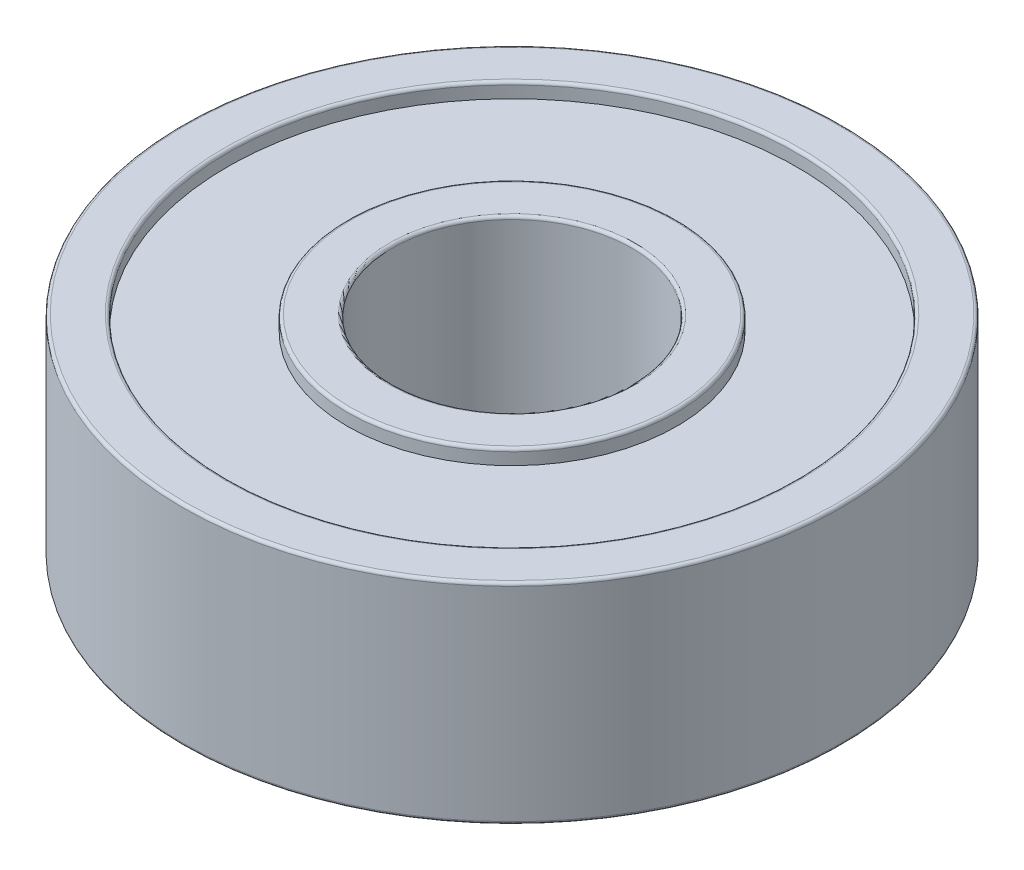
ISO-10303-21;
HEADER;
FILE_DESCRIPTION(('STEP AP214'),'2;1');
FILE_NAME('part.step','',(''),(''),'','','');
FILE_SCHEMA(('AUTOMOTIVE_DESIGN { 1 0 10303 214 1 1 1 1 }'));
ENDSEC;
DATA;
#1=APPLICATION_CONTEXT('core data for automotive mechanical design processes');
#2=APPLICATION_PROTOCOL_DEFINITION('international standard','automotive_design',2000,#1);
#3=PRODUCT_CONTEXT('',#1,'mechanical');
#4=PRODUCT('Part','Part','',(#3));
#5=PRODUCT_RELATED_PRODUCT_CATEGORY('part','',(#4));
#6=PRODUCT_DEFINITION_FORMATION('','',#4);
#7=PRODUCT_DEFINITION_CONTEXT('part definition',#1,'design');
#8=PRODUCT_DEFINITION('design','',#6,#7);
#9=PRODUCT_DEFINITION_SHAPE('','',#8);
#10=(LENGTH_UNIT() NAMED_UNIT(*) SI_UNIT(.MILLI.,.METRE.));
#11=(NAMED_UNIT(*) PLANE_ANGLE_UNIT() SI_UNIT($,.RADIAN.));
#12=(NAMED_UNIT(*) SI_UNIT($,.STERADIAN.) SOLID_ANGLE_UNIT());
#13=UNCERTAINTY_MEASURE_WITH_UNIT(LENGTH_MEASURE(1.E-05),#10,'distance_accuracy_value','');
#14=(GEOMETRIC_REPRESENTATION_CONTEXT(3) GLOBAL_UNCERTAINTY_ASSIGNED_CONTEXT((#13)) GLOBAL_UNIT_ASSIGNED_CONTEXT((#10,
#11,#12)) REPRESENTATION_CONTEXT('',''));
#15=CARTESIAN_POINT('',(0.,0.,0.));
#16=DIRECTION('',(0.,0.,1.));
#17=DIRECTION('',(1.,0.,0.));
#18=AXIS2_PLACEMENT_3D('',#15,#16,#17);
#19=CARTESIAN_POINT('',(0.,-3.5,0.));
#20=DIRECTION('',(0.,1.,0.));
#21=DIRECTION('',(0.,0.,1.));
#22=AXIS2_PLACEMENT_3D('',#19,#20,#21);
#23=PLANE('',#22);
#24=CARTESIAN_POINT('',(0.,-3.5,0.));
#25=DIRECTION('',(0.,1.,0.));
#26=DIRECTION('',(0.,0.,1.));
#27=AXIS2_PLACEMENT_3D('',#24,#25,#26);
#28=CIRCLE('',#27,4.1);
#29=CARTESIAN_POINT('',(0.,-3.5,4.1));
#30=VERTEX_POINT('',#29);
#31=EDGE_CURVE('E58',#30,#30,#28,.T.);
#32=ORIENTED_EDGE('',*,*,#31,.T.);
#33=EDGE_LOOP('',(#32));
#34=FACE_BOUND('',#33,.T.);
#35=CARTESIAN_POINT('',(0.,-3.5,0.));
#36=DIRECTION('',(0.,1.,0.));
#37=DIRECTION('',(0.,0.,1.));
#38=AXIS2_PLACEMENT_3D('',#35,#36,#37);
#39=CIRCLE('',#38,5.4);
#40=CARTESIAN_POINT('',(0.,-3.5,5.4));
#41=VERTEX_POINT('',#40);
#42=EDGE_CURVE('E61',#41,#41,#39,.F.);
#43=ORIENTED_EDGE('',*,*,#42,.T.);
#44=EDGE_LOOP('',(#43));
#45=FACE_BOUND('',#44,.T.);
#46=ADVANCED_FACE('F32',(#34,#45),#23,.F.);
#47=CARTESIAN_POINT('',(0.,3.5,0.));
#48=DIRECTION('',(0.,1.,0.));
#49=DIRECTION('',(0.,0.,1.));
#50=AXIS2_PLACEMENT_3D('',#47,#48,#49);
#51=PLANE('',#50);
#52=CARTESIAN_POINT('',(0.,3.5,0.));
#53=DIRECTION('',(0.,1.,0.));
#54=DIRECTION('',(0.,0.,1.));
#55=AXIS2_PLACEMENT_3D('',#52,#53,#54);
#56=CIRCLE('',#55,4.1);
#57=CARTESIAN_POINT('',(0.,3.5,4.1));
#58=VERTEX_POINT('',#57);
#59=EDGE_CURVE('E79',#58,#58,#56,.F.);
#60=ORIENTED_EDGE('',*,*,#59,.T.);
#61=EDGE_LOOP('',(#60));
#62=FACE_BOUND('',#61,.T.);
#63=CARTESIAN_POINT('',(0.,3.5,0.));
#64=DIRECTION('',(0.,1.,0.));
#65=DIRECTION('',(0.,0.,1.));
#66=AXIS2_PLACEMENT_3D('',#63,#64,#65);
#67=CIRCLE('',#66,5.4);
#68=CARTESIAN_POINT('',(0.,3.5,5.4));
#69=VERTEX_POINT('',#68);
#70=EDGE_CURVE('E82',#69,#69,#67,.T.);
#71=ORIENTED_EDGE('',*,*,#70,.T.);
#72=EDGE_LOOP('',(#71));
#73=FACE_BOUND('',#72,.T.);
#74=ADVANCED_FACE('F119',(#62,#73),#51,.T.);
#75=CARTESIAN_POINT('',(0.,-3.5,0.));
#76=DIRECTION('',(0.,1.,0.));
#77=DIRECTION('',(0.,0.,1.));
#78=AXIS2_PLACEMENT_3D('',#75,#76,#77);
#79=CYLINDRICAL_SURFACE('',#78,11.);
#80=CARTESIAN_POINT('',(0.,-3.4,0.));
#81=DIRECTION('',(0.,1.,0.));
#82=DIRECTION('',(0.,0.,1.));
#83=AXIS2_PLACEMENT_3D('',#80,#81,#82);
#84=CIRCLE('',#83,11.);
#85=CARTESIAN_POINT('',(0.,-3.4,11.));
#86=VERTEX_POINT('',#85);
#87=EDGE_CURVE('E10',#86,#86,#84,.T.);
#88=ORIENTED_EDGE('',*,*,#87,.T.);
#89=EDGE_LOOP('',(#88));
#90=FACE_BOUND('',#89,.T.);
#91=CARTESIAN_POINT('',(0.,3.4,0.));
#92=DIRECTION('',(0.,1.,0.));
#93=DIRECTION('',(0.,0.,1.));
#94=AXIS2_PLACEMENT_3D('',#91,#92,#93);
#95=CIRCLE('',#94,11.);
#96=CARTESIAN_POINT('',(0.,3.4,11.));
#97=VERTEX_POINT('',#96);
#98=EDGE_CURVE('E64',#97,#97,#95,.F.);
#99=ORIENTED_EDGE('',*,*,#98,.T.);
#100=EDGE_LOOP('',(#99));
#101=FACE_BOUND('',#100,.T.);
#102=ADVANCED_FACE('F126',(#90,#101),#79,.T.);
#103=CARTESIAN_POINT('',(0.,-3.5,0.));
#104=DIRECTION('',(0.,1.,0.));
#105=DIRECTION('',(0.,0.,1.));
#106=AXIS2_PLACEMENT_3D('',#103,#104,#105);
#107=CIRCLE('',#106,9.6);
#108=CARTESIAN_POINT('',(0.,-3.5,9.6));
#109=VERTEX_POINT('',#108);
#110=EDGE_CURVE('E43',#109,#109,#107,.T.);
#111=ORIENTED_EDGE('',*,*,#110,.T.);
#112=EDGE_LOOP('',(#111));
#113=FACE_BOUND('',#112,.T.);
#114=CARTESIAN_POINT('',(0.,-3.5,0.));
#115=DIRECTION('',(0.,1.,0.));
#116=DIRECTION('',(0.,0.,1.));
#117=AXIS2_PLACEMENT_3D('',#114,#115,#116);
#118=CIRCLE('',#117,10.9);
#119=CARTESIAN_POINT('',(0.,-3.5,10.9));
#120=VERTEX_POINT('',#119);
#121=EDGE_CURVE('E47',#120,#120,#118,.F.);
#122=ORIENTED_EDGE('',*,*,#121,.T.);
#123=EDGE_LOOP('',(#122));
#124=FACE_BOUND('',#123,.T.);
#125=ADVANCED_FACE('F122',(#113,#124),#23,.F.);
#126=CARTESIAN_POINT('',(0.,-3.5,0.));
#127=DIRECTION('',(0.,1.,0.));
#128=DIRECTION('',(0.,0.,1.));
#129=AXIS2_PLACEMENT_3D('',#126,#127,#128);
#130=CYLINDRICAL_SURFACE('',#129,4.);
#131=CARTESIAN_POINT('',(0.,-3.4,0.));
#132=DIRECTION('',(0.,1.,0.));
#133=DIRECTION('',(0.,0.,1.));
#134=AXIS2_PLACEMENT_3D('',#131,#132,#133);
#135=CIRCLE('',#134,4.);
#136=CARTESIAN_POINT('',(0.,-3.4,4.));
#137=VERTEX_POINT('',#136);
#138=EDGE_CURVE('E55',#137,#137,#135,.F.);
#139=ORIENTED_EDGE('',*,*,#138,.T.);
#140=EDGE_LOOP('',(#139));
#141=FACE_BOUND('',#140,.T.);
#142=CARTESIAN_POINT('',(0.,3.4,0.));
#143=DIRECTION('',(0.,1.,0.));
#144=DIRECTION('',(0.,0.,1.));
#145=AXIS2_PLACEMENT_3D('',#142,#143,#144);
#146=CIRCLE('',#145,4.);
#147=CARTESIAN_POINT('',(0.,3.4,4.));
#148=VERTEX_POINT('',#147);
#149=EDGE_CURVE('E85',#148,#148,#146,.T.);
#150=ORIENTED_EDGE('',*,*,#149,.T.);
#151=EDGE_LOOP('',(#150));
#152=FACE_BOUND('',#151,.T.);
#153=ADVANCED_FACE('F134',(#141,#152),#130,.F.);
#154=CARTESIAN_POINT('',(0.,3.5,0.));
#155=DIRECTION('',(0.,1.,0.));
#156=DIRECTION('',(0.,0.,1.));
#157=AXIS2_PLACEMENT_3D('',#154,#155,#156);
#158=CIRCLE('',#157,9.6);
#159=CARTESIAN_POINT('',(0.,3.5,9.6));
#160=VERTEX_POINT('',#159);
#161=EDGE_CURVE('E67',#160,#160,#158,.F.);
#162=ORIENTED_EDGE('',*,*,#161,.T.);
#163=EDGE_LOOP('',(#162));
#164=FACE_BOUND('',#163,.T.);
#165=CARTESIAN_POINT('',(0.,3.5,0.));
#166=DIRECTION('',(0.,1.,0.));
#167=DIRECTION('',(0.,0.,1.));
#168=AXIS2_PLACEMENT_3D('',#165,#166,#167);
#169=CIRCLE('',#168,10.9);
#170=CARTESIAN_POINT('',(0.,3.5,10.9));
#171=VERTEX_POINT('',#170);
#172=EDGE_CURVE('E70',#171,#171,#169,.T.);
#173=ORIENTED_EDGE('',*,*,#172,.T.);
#174=EDGE_LOOP('',(#173));
#175=FACE_BOUND('',#174,.T.);
#176=ADVANCED_FACE('F129',(#164,#175),#51,.T.);
#177=CARTESIAN_POINT('',(0.,3.,0.));
#178=DIRECTION('',(0.,1.,0.));
#179=DIRECTION('',(0.,0.,1.));
#180=AXIS2_PLACEMENT_3D('',#177,#178,#179);
#181=CYLINDRICAL_SURFACE('',#180,9.5);
#182=CARTESIAN_POINT('',(0.,3.4,0.));
#183=DIRECTION('',(0.,1.,0.));
#184=DIRECTION('',(0.,0.,1.));
#185=AXIS2_PLACEMENT_3D('',#182,#183,#184);
#186=CIRCLE('',#185,9.5);
#187=CARTESIAN_POINT('',(0.,3.4,9.5));
#188=VERTEX_POINT('',#187);
#189=EDGE_CURVE('E73',#188,#188,#186,.T.);
#190=ORIENTED_EDGE('',*,*,#189,.T.);
#191=EDGE_LOOP('',(#190));
#192=FACE_BOUND('',#191,.T.);
#193=CARTESIAN_POINT('',(0.,3.,0.));
#194=DIRECTION('',(0.,1.,0.));
#195=DIRECTION('',(0.,0.,1.));
#196=AXIS2_PLACEMENT_3D('',#193,#194,#195);
#197=CIRCLE('',#196,9.5);
#198=CARTESIAN_POINT('',(0.,3.,9.5));
#199=VERTEX_POINT('',#198);
#200=EDGE_CURVE('E88',#199,#199,#197,.T.);
#201=ORIENTED_EDGE('',*,*,#200,.F.);
#202=EDGE_LOOP('',(#201));
#203=FACE_BOUND('',#202,.T.);
#204=ADVANCED_FACE('F191',(#192,#203),#181,.F.);
#205=CARTESIAN_POINT('',(0.,3.,0.));
#206=DIRECTION('',(0.,1.,0.));
#207=DIRECTION('',(0.,0.,1.));
#208=AXIS2_PLACEMENT_3D('',#205,#206,#207);
#209=PLANE('',#208);
#210=CARTESIAN_POINT('',(0.,3.,0.));
#211=DIRECTION('',(0.,1.,0.));
#212=DIRECTION('',(0.,0.,1.));
#213=AXIS2_PLACEMENT_3D('',#210,#211,#212);
#214=CIRCLE('',#213,5.5);
#215=CARTESIAN_POINT('',(0.,3.,5.5));
#216=VERTEX_POINT('',#215);
#217=EDGE_CURVE('E91',#216,#216,#214,.T.);
#218=ORIENTED_EDGE('',*,*,#217,.F.);
#219=EDGE_LOOP('',(#218));
#220=FACE_BOUND('',#219,.T.);
#221=ORIENTED_EDGE('',*,*,#200,.T.);
#222=EDGE_LOOP('',(#221));
#223=FACE_BOUND('',#222,.T.);
#224=ADVANCED_FACE('F178',(#220,#223),#209,.T.);
#225=CARTESIAN_POINT('',(0.,3.,0.));
#226=DIRECTION('',(0.,1.,0.));
#227=DIRECTION('',(0.,0.,1.));
#228=AXIS2_PLACEMENT_3D('',#225,#226,#227);
#229=CYLINDRICAL_SURFACE('',#228,5.5);
#230=CARTESIAN_POINT('',(0.,3.4,0.));
#231=DIRECTION('',(0.,1.,0.));
#232=DIRECTION('',(0.,0.,1.));
#233=AXIS2_PLACEMENT_3D('',#230,#231,#232);
#234=CIRCLE('',#233,5.5);
#235=CARTESIAN_POINT('',(0.,3.4,5.5));
#236=VERTEX_POINT('',#235);
#237=EDGE_CURVE('E76',#236,#236,#234,.F.);
#238=ORIENTED_EDGE('',*,*,#237,.T.);
#239=EDGE_LOOP('',(#238));
#240=FACE_BOUND('',#239,.T.);
#241=ORIENTED_EDGE('',*,*,#217,.T.);
#242=EDGE_LOOP('',(#241));
#243=FACE_BOUND('',#242,.T.);
#244=ADVANCED_FACE('F173',(#240,#243),#229,.T.);
#245=CARTESIAN_POINT('',(0.,3.4,0.));
#246=DIRECTION('',(0.,1.,0.));
#247=DIRECTION('',(0.,0.,1.));
#248=AXIS2_PLACEMENT_3D('',#245,#246,#247);
#249=TOROIDAL_SURFACE('',#248,4.1,0.1);
#250=ORIENTED_EDGE('',*,*,#59,.F.);
#251=EDGE_LOOP('',(#250));
#252=FACE_BOUND('',#251,.T.);
#253=ORIENTED_EDGE('',*,*,#149,.F.);
#254=EDGE_LOOP('',(#253));
#255=FACE_BOUND('',#254,.T.);
#256=ADVANCED_FACE('F170',(#252,#255),#249,.T.);
#257=CARTESIAN_POINT('',(0.,3.4,0.));
#258=DIRECTION('',(0.,1.,0.));
#259=DIRECTION('',(0.,0.,1.));
#260=AXIS2_PLACEMENT_3D('',#257,#258,#259);
#261=TOROIDAL_SURFACE('',#260,5.4,0.1);
#262=ORIENTED_EDGE('',*,*,#237,.F.);
#263=EDGE_LOOP('',(#262));
#264=FACE_BOUND('',#263,.T.);
#265=ORIENTED_EDGE('',*,*,#70,.F.);
#266=EDGE_LOOP('',(#265));
#267=FACE_BOUND('',#266,.T.);
#268=ADVANCED_FACE('F166',(#264,#267),#261,.T.);
#269=CARTESIAN_POINT('',(0.,3.4,0.));
#270=DIRECTION('',(0.,1.,0.));
#271=DIRECTION('',(0.,0.,1.));
#272=AXIS2_PLACEMENT_3D('',#269,#270,#271);
#273=TOROIDAL_SURFACE('',#272,9.6,0.1);
#274=ORIENTED_EDGE('',*,*,#161,.F.);
#275=EDGE_LOOP('',(#274));
#276=FACE_BOUND('',#275,.T.);
#277=ORIENTED_EDGE('',*,*,#189,.F.);
#278=EDGE_LOOP('',(#277));
#279=FACE_BOUND('',#278,.T.);
#280=ADVANCED_FACE('F162',(#276,#279),#273,.T.);
#281=CARTESIAN_POINT('',(0.,3.4,0.));
#282=DIRECTION('',(0.,1.,0.));
#283=DIRECTION('',(0.,0.,1.));
#284=AXIS2_PLACEMENT_3D('',#281,#282,#283);
#285=TOROIDAL_SURFACE('',#284,10.9,0.1);
#286=ORIENTED_EDGE('',*,*,#98,.F.);
#287=EDGE_LOOP('',(#286));
#288=FACE_BOUND('',#287,.T.);
#289=ORIENTED_EDGE('',*,*,#172,.F.);
#290=EDGE_LOOP('',(#289));
#291=FACE_BOUND('',#290,.T.);
#292=ADVANCED_FACE('F159',(#288,#291),#285,.T.);
#293=CARTESIAN_POINT('',(0.,-3.,0.));
#294=DIRECTION('',(0.,-1.,0.));
#295=DIRECTION('',(0.,0.,1.));
#296=AXIS2_PLACEMENT_3D('',#293,#294,#295);
#297=PLANE('',#296);
#298=CARTESIAN_POINT('',(0.,-3.,0.));
#299=DIRECTION('',(0.,1.,0.));
#300=DIRECTION('',(0.,0.,1.));
#301=AXIS2_PLACEMENT_3D('',#298,#299,#300);
#302=CIRCLE('',#301,9.5);
#303=CARTESIAN_POINT('',(0.,-3.,9.5));
#304=VERTEX_POINT('',#303);
#305=EDGE_CURVE('E94',#304,#304,#302,.T.);
#306=ORIENTED_EDGE('',*,*,#305,.F.);
#307=EDGE_LOOP('',(#306));
#308=FACE_BOUND('',#307,.T.);
#309=CARTESIAN_POINT('',(0.,-3.,0.));
#310=DIRECTION('',(0.,1.,0.));
#311=DIRECTION('',(0.,0.,1.));
#312=AXIS2_PLACEMENT_3D('',#309,#310,#311);
#313=CIRCLE('',#312,5.5);
#314=CARTESIAN_POINT('',(0.,-3.,5.5));
#315=VERTEX_POINT('',#314);
#316=EDGE_CURVE('E97',#315,#315,#313,.T.);
#317=ORIENTED_EDGE('',*,*,#316,.T.);
#318=EDGE_LOOP('',(#317));
#319=FACE_BOUND('',#318,.T.);
#320=ADVANCED_FACE('F101',(#308,#319),#297,.T.);
#321=CARTESIAN_POINT('',(0.,-3.,0.));
#322=DIRECTION('',(0.,-1.,0.));
#323=DIRECTION('',(0.,0.,-1.));
#324=AXIS2_PLACEMENT_3D('',#321,#322,#323);
#325=CYLINDRICAL_SURFACE('',#324,9.5);
#326=CARTESIAN_POINT('',(0.,-3.4,0.));
#327=DIRECTION('',(0.,1.,0.));
#328=DIRECTION('',(0.,0.,1.));
#329=AXIS2_PLACEMENT_3D('',#326,#327,#328);
#330=CIRCLE('',#329,9.5);
#331=CARTESIAN_POINT('',(0.,-3.4,9.5));
#332=VERTEX_POINT('',#331);
#333=EDGE_CURVE('E39',#332,#332,#330,.F.);
#334=ORIENTED_EDGE('',*,*,#333,.T.);
#335=EDGE_LOOP('',(#334));
#336=FACE_BOUND('',#335,.T.);
#337=ORIENTED_EDGE('',*,*,#305,.T.);
#338=EDGE_LOOP('',(#337));
#339=FACE_BOUND('',#338,.T.);
#340=ADVANCED_FACE('F106',(#336,#339),#325,.F.);
#341=CARTESIAN_POINT('',(0.,-3.,0.));
#342=DIRECTION('',(0.,-1.,0.));
#343=DIRECTION('',(0.,0.,-1.));
#344=AXIS2_PLACEMENT_3D('',#341,#342,#343);
#345=CYLINDRICAL_SURFACE('',#344,5.5);
#346=CARTESIAN_POINT('',(0.,-3.4,0.));
#347=DIRECTION('',(0.,1.,0.));
#348=DIRECTION('',(0.,0.,1.));
#349=AXIS2_PLACEMENT_3D('',#346,#347,#348);
#350=CIRCLE('',#349,5.5);
#351=CARTESIAN_POINT('',(0.,-3.4,5.5));
#352=VERTEX_POINT('',#351);
#353=EDGE_CURVE('E52',#352,#352,#350,.T.);
#354=ORIENTED_EDGE('',*,*,#353,.T.);
#355=EDGE_LOOP('',(#354));
#356=FACE_BOUND('',#355,.T.);
#357=ORIENTED_EDGE('',*,*,#316,.F.);
#358=EDGE_LOOP('',(#357));
#359=FACE_BOUND('',#358,.T.);
#360=ADVANCED_FACE('F103',(#356,#359),#345,.T.);
#361=CARTESIAN_POINT('',(0.,-3.4,0.));
#362=DIRECTION('',(0.,1.,0.));
#363=DIRECTION('',(0.,0.,1.));
#364=AXIS2_PLACEMENT_3D('',#361,#362,#363);
#365=TOROIDAL_SURFACE('',#364,4.1,0.1);
#366=ORIENTED_EDGE('',*,*,#138,.F.);
#367=EDGE_LOOP('',(#366));
#368=FACE_BOUND('',#367,.T.);
#369=ORIENTED_EDGE('',*,*,#31,.F.);
#370=EDGE_LOOP('',(#369));
#371=FACE_BOUND('',#370,.T.);
#372=ADVANCED_FACE('F105',(#368,#371),#365,.T.);
#373=CARTESIAN_POINT('',(0.,-3.4,0.));
#374=DIRECTION('',(0.,1.,0.));
#375=DIRECTION('',(0.,0.,1.));
#376=AXIS2_PLACEMENT_3D('',#373,#374,#375);
#377=TOROIDAL_SURFACE('',#376,5.4,0.1);
#378=ORIENTED_EDGE('',*,*,#42,.F.);
#379=EDGE_LOOP('',(#378));
#380=FACE_BOUND('',#379,.T.);
#381=ORIENTED_EDGE('',*,*,#353,.F.);
#382=EDGE_LOOP('',(#381));
#383=FACE_BOUND('',#382,.T.);
#384=ADVANCED_FACE('F113',(#380,#383),#377,.T.);
#385=CARTESIAN_POINT('',(0.,-3.4,0.));
#386=DIRECTION('',(0.,1.,0.));
#387=DIRECTION('',(0.,0.,1.));
#388=AXIS2_PLACEMENT_3D('',#385,#386,#387);
#389=TOROIDAL_SURFACE('',#388,9.6,0.1);
#390=ORIENTED_EDGE('',*,*,#333,.F.);
#391=EDGE_LOOP('',(#390));
#392=FACE_BOUND('',#391,.T.);
#393=ORIENTED_EDGE('',*,*,#110,.F.);
#394=EDGE_LOOP('',(#393));
#395=FACE_BOUND('',#394,.T.);
#396=ADVANCED_FACE('F147',(#392,#395),#389,.T.);
#397=CARTESIAN_POINT('',(0.,-3.4,0.));
#398=DIRECTION('',(0.,1.,0.));
#399=DIRECTION('',(0.,0.,1.));
#400=AXIS2_PLACEMENT_3D('',#397,#398,#399);
#401=TOROIDAL_SURFACE('',#400,10.9,0.1);
#402=ORIENTED_EDGE('',*,*,#121,.F.);
#403=EDGE_LOOP('',(#402));
#404=FACE_BOUND('',#403,.T.);
#405=ORIENTED_EDGE('',*,*,#87,.F.);
#406=EDGE_LOOP('',(#405));
#407=FACE_BOUND('',#406,.T.);
#408=ADVANCED_FACE('F34',(#404,#407),#401,.T.);
#409=CLOSED_SHELL('',(#46,#74,#102,#125,#153,#176,#204,#224,#244,#256,#268,#280,#292,#320,#340,
#360,#372,#384,#396,#408));
#410=MANIFOLD_SOLID_BREP('B2',#409);
#411=ADVANCED_BREP_SHAPE_REPRESENTATION('',(#18,#410),#14);
#412=SHAPE_DEFINITION_REPRESENTATION(#9,#411);
ENDSEC;
END-ISO-10303-21;
